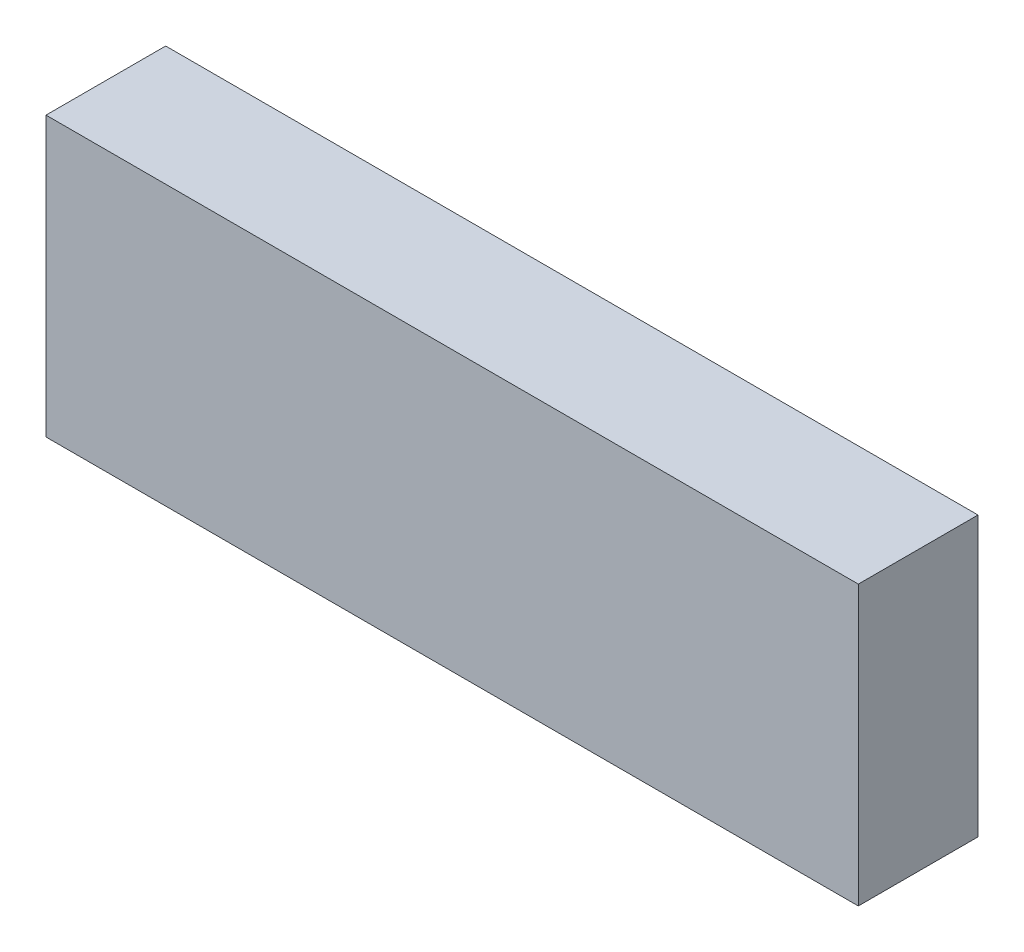
ISO-10303-21;
HEADER;
FILE_DESCRIPTION(('STEP AP214'),'2;1');
FILE_NAME('part.step','',(''),(''),'','','');
FILE_SCHEMA(('AUTOMOTIVE_DESIGN { 1 0 10303 214 1 1 1 1 }'));
ENDSEC;
DATA;
#1=APPLICATION_CONTEXT('core data for automotive mechanical design processes');
#2=APPLICATION_PROTOCOL_DEFINITION('international standard','automotive_design',2000,#1);
#3=PRODUCT_CONTEXT('',#1,'mechanical');
#4=PRODUCT('Part','Part','',(#3));
#5=PRODUCT_RELATED_PRODUCT_CATEGORY('part','',(#4));
#6=PRODUCT_DEFINITION_FORMATION('','',#4);
#7=PRODUCT_DEFINITION_CONTEXT('part definition',#1,'design');
#8=PRODUCT_DEFINITION('design','',#6,#7);
#9=PRODUCT_DEFINITION_SHAPE('','',#8);
#10=(LENGTH_UNIT() NAMED_UNIT(*) SI_UNIT(.MILLI.,.METRE.));
#11=(NAMED_UNIT(*) PLANE_ANGLE_UNIT() SI_UNIT($,.RADIAN.));
#12=(NAMED_UNIT(*) SI_UNIT($,.STERADIAN.) SOLID_ANGLE_UNIT());
#13=UNCERTAINTY_MEASURE_WITH_UNIT(LENGTH_MEASURE(1.E-05),#10,'distance_accuracy_value','');
#14=(GEOMETRIC_REPRESENTATION_CONTEXT(3) GLOBAL_UNCERTAINTY_ASSIGNED_CONTEXT((#13)) GLOBAL_UNIT_ASSIGNED_CONTEXT((#10,
#11,#12)) REPRESENTATION_CONTEXT('',''));
#15=CARTESIAN_POINT('',(0.,0.,0.));
#16=DIRECTION('',(0.,0.,1.));
#17=DIRECTION('',(1.,0.,0.));
#18=AXIS2_PLACEMENT_3D('',#15,#16,#17);
#19=CARTESIAN_POINT('',(0.,0.,10.));
#20=DIRECTION('',(1.,0.,0.));
#21=DIRECTION('',(0.,1.,0.));
#22=AXIS2_PLACEMENT_3D('',#19,#20,#21);
#23=PLANE('',#22);
#24=DIRECTION('',(0.,-1.,0.));
#25=VECTOR('',#24,1.);
#26=CARTESIAN_POINT('',(0.,0.,0.));
#27=LINE('',#26,#25);
#28=CARTESIAN_POINT('',(0.,0.,0.));
#29=VERTEX_POINT('',#28);
#30=CARTESIAN_POINT('',(0.,-23.2918,0.));
#31=VERTEX_POINT('',#30);
#32=EDGE_CURVE('E96',#29,#31,#27,.T.);
#33=ORIENTED_EDGE('',*,*,#32,.T.);
#34=DIRECTION('',(0.,0.,-1.));
#35=VECTOR('',#34,1.);
#36=CARTESIAN_POINT('',(0.,-23.2918,10.));
#37=LINE('',#36,#35);
#38=CARTESIAN_POINT('',(0.,-23.2918,10.));
#39=VERTEX_POINT('',#38);
#40=EDGE_CURVE('E11',#39,#31,#37,.T.);
#41=ORIENTED_EDGE('',*,*,#40,.F.);
#42=DIRECTION('',(0.,-1.,0.));
#43=VECTOR('',#42,1.);
#44=CARTESIAN_POINT('',(0.,0.,10.));
#45=LINE('',#44,#43);
#46=CARTESIAN_POINT('',(0.,0.,10.));
#47=VERTEX_POINT('',#46);
#48=EDGE_CURVE('E84',#47,#39,#45,.T.);
#49=ORIENTED_EDGE('',*,*,#48,.F.);
#50=DIRECTION('',(0.,0.,-1.));
#51=VECTOR('',#50,1.);
#52=CARTESIAN_POINT('',(0.,0.,10.));
#53=LINE('',#52,#51);
#54=EDGE_CURVE('E92',#47,#29,#53,.T.);
#55=ORIENTED_EDGE('',*,*,#54,.T.);
#56=EDGE_LOOP('',(#33,#41,#49,#55));
#57=FACE_BOUND('',#56,.T.);
#58=ADVANCED_FACE('F33',(#57),#23,.F.);
#59=CARTESIAN_POINT('',(0.,-23.2918,10.));
#60=DIRECTION('',(0.,1.,0.));
#61=DIRECTION('',(0.,0.,1.));
#62=AXIS2_PLACEMENT_3D('',#59,#60,#61);
#63=PLANE('',#62);
#64=DIRECTION('',(1.,0.,0.));
#65=VECTOR('',#64,1.);
#66=CARTESIAN_POINT('',(0.,-23.2918,0.));
#67=LINE('',#66,#65);
#68=CARTESIAN_POINT('',(67.8688,-23.2918,0.));
#69=VERTEX_POINT('',#68);
#70=EDGE_CURVE('E88',#31,#69,#67,.T.);
#71=ORIENTED_EDGE('',*,*,#70,.T.);
#72=DIRECTION('',(0.,0.,-1.));
#73=VECTOR('',#72,1.);
#74=CARTESIAN_POINT('',(67.8688,-23.2918,10.));
#75=LINE('',#74,#73);
#76=CARTESIAN_POINT('',(67.8688,-23.2918,10.));
#77=VERTEX_POINT('',#76);
#78=EDGE_CURVE('E41',#77,#69,#75,.T.);
#79=ORIENTED_EDGE('',*,*,#78,.F.);
#80=DIRECTION('',(1.,0.,0.));
#81=VECTOR('',#80,1.);
#82=CARTESIAN_POINT('',(0.,-23.2918,10.));
#83=LINE('',#82,#81);
#84=EDGE_CURVE('E79',#39,#77,#83,.T.);
#85=ORIENTED_EDGE('',*,*,#84,.F.);
#86=ORIENTED_EDGE('',*,*,#40,.T.);
#87=EDGE_LOOP('',(#71,#79,#85,#86));
#88=FACE_BOUND('',#87,.T.);
#89=ADVANCED_FACE('F87',(#88),#63,.F.);
#90=CARTESIAN_POINT('',(67.8688,0.,10.));
#91=DIRECTION('',(-1.,0.,0.));
#92=DIRECTION('',(0.,0.,1.));
#93=AXIS2_PLACEMENT_3D('',#90,#91,#92);
#94=PLANE('',#93);
#95=DIRECTION('',(0.,1.,0.));
#96=VECTOR('',#95,1.);
#97=CARTESIAN_POINT('',(67.8688,0.,0.));
#98=LINE('',#97,#96);
#99=CARTESIAN_POINT('',(67.8688,0.,0.));
#100=VERTEX_POINT('',#99);
#101=EDGE_CURVE('E66',#69,#100,#98,.T.);
#102=ORIENTED_EDGE('',*,*,#101,.T.);
#103=DIRECTION('',(0.,0.,-1.));
#104=VECTOR('',#103,1.);
#105=CARTESIAN_POINT('',(67.8688,0.,10.));
#106=LINE('',#105,#104);
#107=CARTESIAN_POINT('',(67.8688,0.,10.));
#108=VERTEX_POINT('',#107);
#109=EDGE_CURVE('E89',#108,#100,#106,.T.);
#110=ORIENTED_EDGE('',*,*,#109,.F.);
#111=DIRECTION('',(0.,1.,0.));
#112=VECTOR('',#111,1.);
#113=CARTESIAN_POINT('',(67.8688,0.,10.));
#114=LINE('',#113,#112);
#115=EDGE_CURVE('E82',#77,#108,#114,.T.);
#116=ORIENTED_EDGE('',*,*,#115,.F.);
#117=ORIENTED_EDGE('',*,*,#78,.T.);
#118=EDGE_LOOP('',(#102,#110,#116,#117));
#119=FACE_BOUND('',#118,.T.);
#120=ADVANCED_FACE('F90',(#119),#94,.F.);
#121=CARTESIAN_POINT('',(0.,0.,10.));
#122=DIRECTION('',(0.,-1.,0.));
#123=DIRECTION('',(0.,0.,-1.));
#124=AXIS2_PLACEMENT_3D('',#121,#122,#123);
#125=PLANE('',#124);
#126=DIRECTION('',(-1.,0.,0.));
#127=VECTOR('',#126,1.);
#128=CARTESIAN_POINT('',(0.,0.,0.));
#129=LINE('',#128,#127);
#130=EDGE_CURVE('E72',#100,#29,#129,.T.);
#131=ORIENTED_EDGE('',*,*,#130,.T.);
#132=ORIENTED_EDGE('',*,*,#54,.F.);
#133=DIRECTION('',(-1.,0.,0.));
#134=VECTOR('',#133,1.);
#135=CARTESIAN_POINT('',(0.,0.,10.));
#136=LINE('',#135,#134);
#137=EDGE_CURVE('E49',#108,#47,#136,.T.);
#138=ORIENTED_EDGE('',*,*,#137,.F.);
#139=ORIENTED_EDGE('',*,*,#109,.T.);
#140=EDGE_LOOP('',(#131,#132,#138,#139));
#141=FACE_BOUND('',#140,.T.);
#142=ADVANCED_FACE('F103',(#141),#125,.F.);
#143=CARTESIAN_POINT('',(0.,0.,10.));
#144=DIRECTION('',(0.,0.,1.));
#145=DIRECTION('',(1.,0.,0.));
#146=AXIS2_PLACEMENT_3D('',#143,#144,#145);
#147=PLANE('',#146);
#148=ORIENTED_EDGE('',*,*,#48,.T.);
#149=ORIENTED_EDGE('',*,*,#84,.T.);
#150=ORIENTED_EDGE('',*,*,#115,.T.);
#151=ORIENTED_EDGE('',*,*,#137,.T.);
#152=EDGE_LOOP('',(#148,#149,#150,#151));
#153=FACE_BOUND('',#152,.T.);
#154=ADVANCED_FACE('F80',(#153),#147,.T.);
#155=CARTESIAN_POINT('',(0.,0.,0.));
#156=DIRECTION('',(0.,0.,1.));
#157=DIRECTION('',(1.,0.,0.));
#158=AXIS2_PLACEMENT_3D('',#155,#156,#157);
#159=PLANE('',#158);
#160=ORIENTED_EDGE('',*,*,#32,.F.);
#161=ORIENTED_EDGE('',*,*,#130,.F.);
#162=ORIENTED_EDGE('',*,*,#101,.F.);
#163=ORIENTED_EDGE('',*,*,#70,.F.);
#164=EDGE_LOOP('',(#160,#161,#162,#163));
#165=FACE_BOUND('',#164,.T.);
#166=ADVANCED_FACE('F106',(#165),#159,.F.);
#167=CLOSED_SHELL('',(#58,#89,#120,#142,#154,#166));
#168=MANIFOLD_SOLID_BREP('B2',#167);
#169=ADVANCED_BREP_SHAPE_REPRESENTATION('',(#18,#168),#14);
#170=SHAPE_DEFINITION_REPRESENTATION(#9,#169);
ENDSEC;
END-ISO-10303-21;
